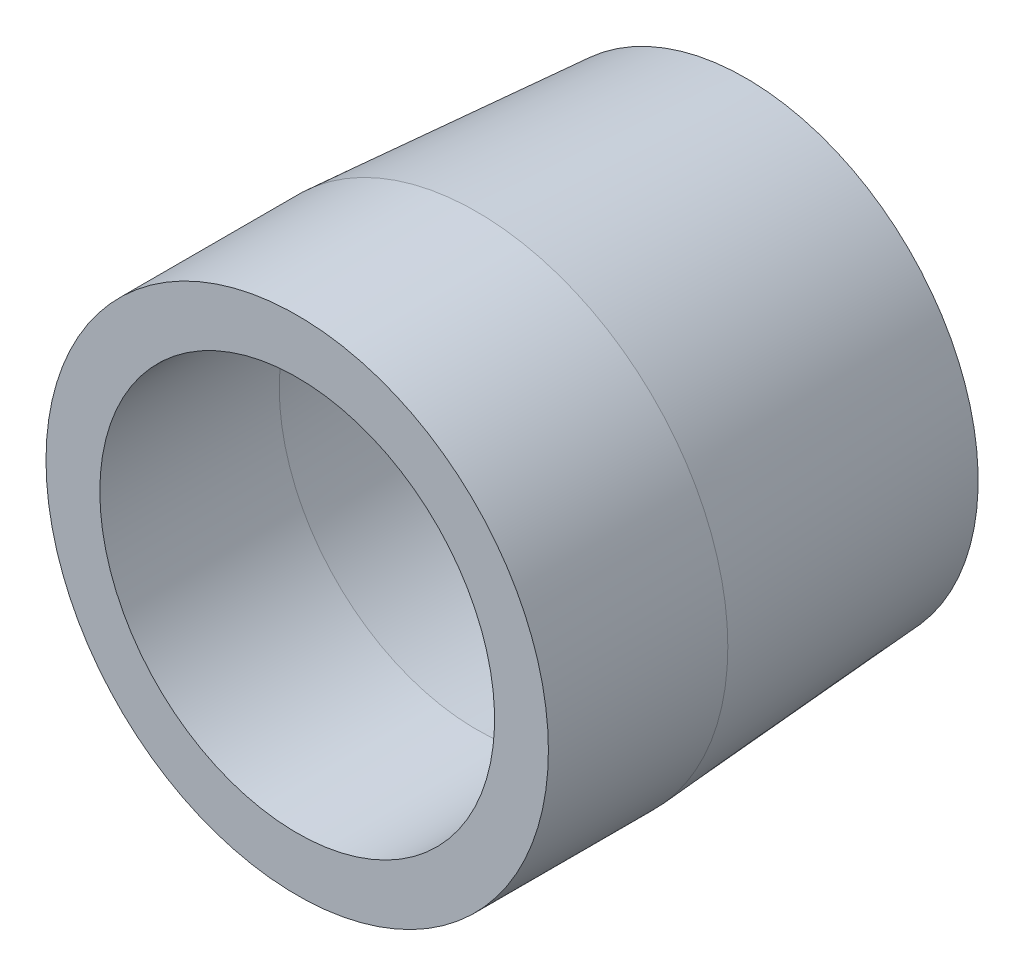
ISO-10303-21;
HEADER;
FILE_DESCRIPTION(('STEP AP214'),'2;1');
FILE_NAME('part.step','',(''),(''),'','','');
FILE_SCHEMA(('AUTOMOTIVE_DESIGN { 1 0 10303 214 1 1 1 1 }'));
ENDSEC;
DATA;
#1=APPLICATION_CONTEXT('core data for automotive mechanical design processes');
#2=APPLICATION_PROTOCOL_DEFINITION('international standard','automotive_design',2000,#1);
#3=PRODUCT_CONTEXT('',#1,'mechanical');
#4=PRODUCT('Part','Part','',(#3));
#5=PRODUCT_RELATED_PRODUCT_CATEGORY('part','',(#4));
#6=PRODUCT_DEFINITION_FORMATION('','',#4);
#7=PRODUCT_DEFINITION_CONTEXT('part definition',#1,'design');
#8=PRODUCT_DEFINITION('design','',#6,#7);
#9=PRODUCT_DEFINITION_SHAPE('','',#8);
#10=(LENGTH_UNIT() NAMED_UNIT(*) SI_UNIT(.MILLI.,.METRE.));
#11=(NAMED_UNIT(*) PLANE_ANGLE_UNIT() SI_UNIT($,.RADIAN.));
#12=(NAMED_UNIT(*) SI_UNIT($,.STERADIAN.) SOLID_ANGLE_UNIT());
#13=UNCERTAINTY_MEASURE_WITH_UNIT(LENGTH_MEASURE(1.E-05),#10,'distance_accuracy_value','');
#14=(GEOMETRIC_REPRESENTATION_CONTEXT(3) GLOBAL_UNCERTAINTY_ASSIGNED_CONTEXT((#13)) GLOBAL_UNIT_ASSIGNED_CONTEXT((#10,
#11,#12)) REPRESENTATION_CONTEXT('',''));
#15=CARTESIAN_POINT('',(0.,0.,0.));
#16=DIRECTION('',(0.,0.,1.));
#17=DIRECTION('',(1.,0.,0.));
#18=AXIS2_PLACEMENT_3D('',#15,#16,#17);
#19=CARTESIAN_POINT('',(0.,0.,20.));
#20=DIRECTION('',(0.,0.,-1.));
#21=DIRECTION('',(-1.,0.,0.));
#22=AXIS2_PLACEMENT_3D('',#19,#20,#21);
#23=CYLINDRICAL_SURFACE('',#22,28.);
#24=CARTESIAN_POINT('',(0.,0.,20.));
#25=DIRECTION('',(0.,0.,1.));
#26=DIRECTION('',(1.,0.,0.));
#27=AXIS2_PLACEMENT_3D('',#24,#25,#26);
#28=CIRCLE('',#27,28.);
#29=CARTESIAN_POINT('',(28.,0.,20.));
#30=VERTEX_POINT('',#29);
#31=EDGE_CURVE('E10',#30,#30,#28,.T.);
#32=ORIENTED_EDGE('',*,*,#31,.F.);
#33=EDGE_LOOP('',(#32));
#34=FACE_BOUND('',#33,.T.);
#35=CARTESIAN_POINT('',(0.,0.,0.));
#36=DIRECTION('',(0.,0.,-1.));
#37=DIRECTION('',(-1.,0.,0.));
#38=AXIS2_PLACEMENT_3D('',#35,#36,#37);
#39=CIRCLE('',#38,28.);
#40=CARTESIAN_POINT('',(-28.,0.,0.));
#41=VERTEX_POINT('',#40);
#42=EDGE_CURVE('E59',#41,#41,#39,.T.);
#43=ORIENTED_EDGE('',*,*,#42,.F.);
#44=EDGE_LOOP('',(#43));
#45=FACE_BOUND('',#44,.T.);
#46=ADVANCED_FACE('F37',(#34,#45),#23,.T.);
#47=CARTESIAN_POINT('',(0.,0.,20.));
#48=DIRECTION('',(0.,0.,1.));
#49=DIRECTION('',(1.,0.,0.));
#50=AXIS2_PLACEMENT_3D('',#47,#48,#49);
#51=PLANE('',#50);
#52=CARTESIAN_POINT('',(0.,0.,20.));
#53=DIRECTION('',(0.,0.,-1.));
#54=DIRECTION('',(-1.,0.,0.));
#55=AXIS2_PLACEMENT_3D('',#52,#53,#54);
#56=CIRCLE('',#55,22.);
#57=CARTESIAN_POINT('',(-22.,0.,20.));
#58=VERTEX_POINT('',#57);
#59=EDGE_CURVE('E43',#58,#58,#56,.T.);
#60=ORIENTED_EDGE('',*,*,#59,.T.);
#61=EDGE_LOOP('',(#60));
#62=FACE_BOUND('',#61,.T.);
#63=ORIENTED_EDGE('',*,*,#31,.T.);
#64=EDGE_LOOP('',(#63));
#65=FACE_BOUND('',#64,.T.);
#66=ADVANCED_FACE('F66',(#62,#65),#51,.T.);
#67=CARTESIAN_POINT('',(0.,0.,20.));
#68=DIRECTION('',(0.,0.,-1.));
#69=DIRECTION('',(-1.,0.,0.));
#70=AXIS2_PLACEMENT_3D('',#67,#68,#69);
#71=CYLINDRICAL_SURFACE('',#70,22.);
#72=ORIENTED_EDGE('',*,*,#59,.F.);
#73=EDGE_LOOP('',(#72));
#74=FACE_BOUND('',#73,.T.);
#75=CARTESIAN_POINT('',(0.,0.,0.));
#76=DIRECTION('',(0.,0.,-1.));
#77=DIRECTION('',(-1.,0.,0.));
#78=AXIS2_PLACEMENT_3D('',#75,#76,#77);
#79=CIRCLE('',#78,22.);
#80=CARTESIAN_POINT('',(-22.,0.,0.));
#81=VERTEX_POINT('',#80);
#82=EDGE_CURVE('E56',#81,#81,#79,.F.);
#83=ORIENTED_EDGE('',*,*,#82,.F.);
#84=EDGE_LOOP('',(#83));
#85=FACE_BOUND('',#84,.T.);
#86=ADVANCED_FACE('F71',(#74,#85),#71,.F.);
#87=CARTESIAN_POINT('',(0.,0.,0.));
#88=DIRECTION('',(0.,0.,1.));
#89=DIRECTION('',(-1.,0.,0.));
#90=AXIS2_PLACEMENT_3D('',#87,#88,#89);
#91=CONICAL_SURFACE('',#90,28.,0.0698131700797732);
#92=CARTESIAN_POINT('',(0.,0.,-30.));
#93=DIRECTION('',(0.,0.,-1.));
#94=DIRECTION('',(-1.,0.,0.));
#95=AXIS2_PLACEMENT_3D('',#92,#93,#94);
#96=CIRCLE('',#95,25.9021956416947);
#97=CARTESIAN_POINT('',(-25.9021956416947,0.,-30.));
#98=VERTEX_POINT('',#97);
#99=EDGE_CURVE('E51',#98,#98,#96,.T.);
#100=ORIENTED_EDGE('',*,*,#99,.F.);
#101=EDGE_LOOP('',(#100));
#102=FACE_BOUND('',#101,.T.);
#103=ORIENTED_EDGE('',*,*,#42,.T.);
#104=EDGE_LOOP('',(#103));
#105=FACE_BOUND('',#104,.T.);
#106=ADVANCED_FACE('F63',(#102,#105),#91,.T.);
#107=CARTESIAN_POINT('',(0.,0.,0.));
#108=DIRECTION('',(0.,0.,-1.));
#109=DIRECTION('',(-1.,0.,0.));
#110=AXIS2_PLACEMENT_3D('',#107,#108,#109);
#111=CONICAL_SURFACE('',#110,22.,0.0698131700797732);
#112=CARTESIAN_POINT('',(0.,0.,-30.));
#113=DIRECTION('',(0.,0.,-1.));
#114=DIRECTION('',(-1.,0.,0.));
#115=AXIS2_PLACEMENT_3D('',#112,#113,#114);
#116=CIRCLE('',#115,24.0978043583053);
#117=CARTESIAN_POINT('',(-24.0978043583053,0.,-30.));
#118=VERTEX_POINT('',#117);
#119=EDGE_CURVE('E47',#118,#118,#116,.F.);
#120=ORIENTED_EDGE('',*,*,#119,.F.);
#121=EDGE_LOOP('',(#120));
#122=FACE_BOUND('',#121,.T.);
#123=ORIENTED_EDGE('',*,*,#82,.T.);
#124=EDGE_LOOP('',(#123));
#125=FACE_BOUND('',#124,.T.);
#126=ADVANCED_FACE('F78',(#122,#125),#111,.F.);
#127=CARTESIAN_POINT('',(0.,0.,-30.));
#128=DIRECTION('',(0.,0.,-1.));
#129=DIRECTION('',(-1.,0.,0.));
#130=AXIS2_PLACEMENT_3D('',#127,#128,#129);
#131=PLANE('',#130);
#132=ORIENTED_EDGE('',*,*,#99,.T.);
#133=EDGE_LOOP('',(#132));
#134=FACE_BOUND('',#133,.T.);
#135=ORIENTED_EDGE('',*,*,#119,.T.);
#136=EDGE_LOOP('',(#135));
#137=FACE_BOUND('',#136,.T.);
#138=ADVANCED_FACE('F81',(#134,#137),#131,.T.);
#139=CLOSED_SHELL('',(#46,#66,#86,#106,#126,#138));
#140=MANIFOLD_SOLID_BREP('B2',#139);
#141=ADVANCED_BREP_SHAPE_REPRESENTATION('',(#18,#140),#14);
#142=SHAPE_DEFINITION_REPRESENTATION(#9,#141);
ENDSEC;
END-ISO-10303-21;
